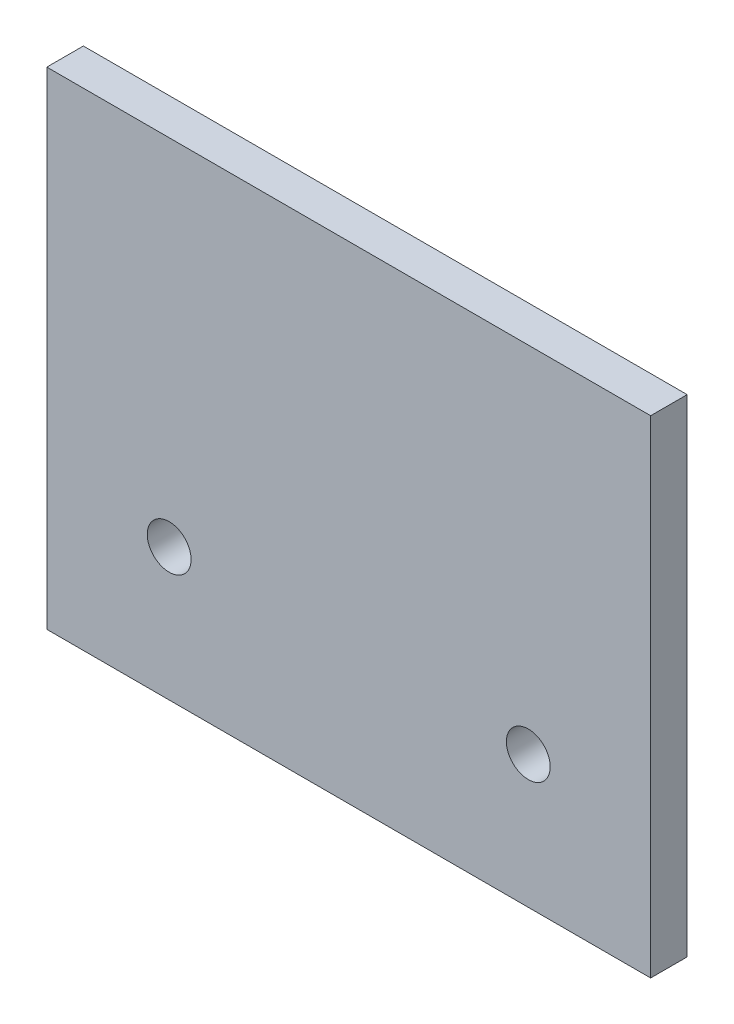
ISO-10303-21;
HEADER;
FILE_DESCRIPTION(('STEP AP214'),'2;1');
FILE_NAME('part.step','',(''),(''),'','','');
FILE_SCHEMA(('AUTOMOTIVE_DESIGN { 1 0 10303 214 1 1 1 1 }'));
ENDSEC;
DATA;
#1=APPLICATION_CONTEXT('core data for automotive mechanical design processes');
#2=APPLICATION_PROTOCOL_DEFINITION('international standard','automotive_design',2000,#1);
#3=PRODUCT_CONTEXT('',#1,'mechanical');
#4=PRODUCT('Part','Part','',(#3));
#5=PRODUCT_RELATED_PRODUCT_CATEGORY('part','',(#4));
#6=PRODUCT_DEFINITION_FORMATION('','',#4);
#7=PRODUCT_DEFINITION_CONTEXT('part definition',#1,'design');
#8=PRODUCT_DEFINITION('design','',#6,#7);
#9=PRODUCT_DEFINITION_SHAPE('','',#8);
#10=(LENGTH_UNIT() NAMED_UNIT(*) SI_UNIT(.MILLI.,.METRE.));
#11=(NAMED_UNIT(*) PLANE_ANGLE_UNIT() SI_UNIT($,.RADIAN.));
#12=(NAMED_UNIT(*) SI_UNIT($,.STERADIAN.) SOLID_ANGLE_UNIT());
#13=UNCERTAINTY_MEASURE_WITH_UNIT(LENGTH_MEASURE(1.E-05),#10,'distance_accuracy_value','');
#14=(GEOMETRIC_REPRESENTATION_CONTEXT(3) GLOBAL_UNCERTAINTY_ASSIGNED_CONTEXT((#13)) GLOBAL_UNIT_ASSIGNED_CONTEXT((#10,
#11,#12)) REPRESENTATION_CONTEXT('',''));
#15=CARTESIAN_POINT('',(0.,0.,0.));
#16=DIRECTION('',(0.,0.,1.));
#17=DIRECTION('',(1.,0.,0.));
#18=AXIS2_PLACEMENT_3D('',#15,#16,#17);
#19=CARTESIAN_POINT('',(0.,0.,3.));
#20=DIRECTION('',(0.,0.,-1.));
#21=DIRECTION('',(-1.,0.,0.));
#22=AXIS2_PLACEMENT_3D('',#19,#20,#21);
#23=PLANE('',#22);
#24=DIRECTION('',(0.,-1.,0.));
#25=VECTOR('',#24,1.);
#26=CARTESIAN_POINT('',(-67.8127878217333,8.21143567112024,3.));
#27=LINE('',#26,#25);
#28=CARTESIAN_POINT('',(-67.8127878217333,48.2114356711202,3.));
#29=VERTEX_POINT('',#28);
#30=CARTESIAN_POINT('',(-67.8127878217333,8.21143567112024,3.));
#31=VERTEX_POINT('',#30);
#32=EDGE_CURVE('E91',#29,#31,#27,.T.);
#33=ORIENTED_EDGE('',*,*,#32,.T.);
#34=DIRECTION('',(1.,0.,0.));
#35=VECTOR('',#34,1.);
#36=CARTESIAN_POINT('',(-67.8127878217333,8.21143567112024,3.));
#37=LINE('',#36,#35);
#38=CARTESIAN_POINT('',(-18.2127878217333,8.21143567112024,3.));
#39=VERTEX_POINT('',#38);
#40=EDGE_CURVE('E86',#31,#39,#37,.T.);
#41=ORIENTED_EDGE('',*,*,#40,.T.);
#42=DIRECTION('',(0.,1.,0.));
#43=VECTOR('',#42,1.);
#44=CARTESIAN_POINT('',(-18.2127878217333,8.21143567112024,3.));
#45=LINE('',#44,#43);
#46=CARTESIAN_POINT('',(-18.2127878217333,48.2114356711202,3.));
#47=VERTEX_POINT('',#46);
#48=EDGE_CURVE('E89',#39,#47,#45,.T.);
#49=ORIENTED_EDGE('',*,*,#48,.T.);
#50=DIRECTION('',(-1.,0.,0.));
#51=VECTOR('',#50,1.);
#52=CARTESIAN_POINT('',(-67.8127878217333,48.2114356711202,3.));
#53=LINE('',#52,#51);
#54=EDGE_CURVE('E56',#47,#29,#53,.T.);
#55=ORIENTED_EDGE('',*,*,#54,.T.);
#56=EDGE_LOOP('',(#33,#41,#49,#55));
#57=FACE_BOUND('',#56,.T.);
#58=CARTESIAN_POINT('',(-28.2627878217329,19.1012624191651,3.));
#59=DIRECTION('',(0.,0.,1.));
#60=DIRECTION('',(1.,0.,0.));
#61=AXIS2_PLACEMENT_3D('',#58,#59,#60);
#62=CIRCLE('',#61,1.79999999999999);
#63=CARTESIAN_POINT('',(-26.4627878217329,19.1012624191651,3.));
#64=VERTEX_POINT('',#63);
#65=EDGE_CURVE('E106',#64,#64,#62,.T.);
#66=ORIENTED_EDGE('',*,*,#65,.F.);
#67=EDGE_LOOP('',(#66));
#68=FACE_BOUND('',#67,.T.);
#69=CARTESIAN_POINT('',(-57.7627878217332,19.1012624191651,3.));
#70=DIRECTION('',(0.,0.,1.));
#71=DIRECTION('',(1.,0.,0.));
#72=AXIS2_PLACEMENT_3D('',#69,#70,#71);
#73=CIRCLE('',#72,1.79999999999999);
#74=CARTESIAN_POINT('',(-55.9627878217332,19.1012624191651,3.));
#75=VERTEX_POINT('',#74);
#76=EDGE_CURVE('E121',#75,#75,#73,.T.);
#77=ORIENTED_EDGE('',*,*,#76,.F.);
#78=EDGE_LOOP('',(#77));
#79=FACE_BOUND('',#78,.T.);
#80=ADVANCED_FACE('F39',(#57,#68,#79),#23,.F.);
#81=CARTESIAN_POINT('',(0.,0.,0.));
#82=DIRECTION('',(0.,0.,-1.));
#83=DIRECTION('',(-1.,0.,0.));
#84=AXIS2_PLACEMENT_3D('',#81,#82,#83);
#85=PLANE('',#84);
#86=CARTESIAN_POINT('',(-28.2627878217329,19.1012624191651,0.));
#87=DIRECTION('',(0.,0.,1.));
#88=DIRECTION('',(1.,0.,0.));
#89=AXIS2_PLACEMENT_3D('',#86,#87,#88);
#90=CIRCLE('',#89,1.79999999999999);
#91=CARTESIAN_POINT('',(-26.4627878217329,19.1012624191651,0.));
#92=VERTEX_POINT('',#91);
#93=EDGE_CURVE('E118',#92,#92,#90,.T.);
#94=ORIENTED_EDGE('',*,*,#93,.T.);
#95=EDGE_LOOP('',(#94));
#96=FACE_BOUND('',#95,.T.);
#97=DIRECTION('',(0.,-1.,0.));
#98=VECTOR('',#97,1.);
#99=CARTESIAN_POINT('',(-67.8127878217333,8.21143567112024,0.));
#100=LINE('',#99,#98);
#101=CARTESIAN_POINT('',(-67.8127878217333,48.2114356711202,0.));
#102=VERTEX_POINT('',#101);
#103=CARTESIAN_POINT('',(-67.8127878217333,8.21143567112024,0.));
#104=VERTEX_POINT('',#103);
#105=EDGE_CURVE('E103',#102,#104,#100,.T.);
#106=ORIENTED_EDGE('',*,*,#105,.F.);
#107=DIRECTION('',(-1.,0.,0.));
#108=VECTOR('',#107,1.);
#109=CARTESIAN_POINT('',(-67.8127878217333,48.2114356711202,0.));
#110=LINE('',#109,#108);
#111=CARTESIAN_POINT('',(-18.2127878217333,48.2114356711202,0.));
#112=VERTEX_POINT('',#111);
#113=EDGE_CURVE('E79',#112,#102,#110,.T.);
#114=ORIENTED_EDGE('',*,*,#113,.F.);
#115=DIRECTION('',(0.,1.,0.));
#116=VECTOR('',#115,1.);
#117=CARTESIAN_POINT('',(-18.2127878217333,8.21143567112024,0.));
#118=LINE('',#117,#116);
#119=CARTESIAN_POINT('',(-18.2127878217333,8.21143567112024,0.));
#120=VERTEX_POINT('',#119);
#121=EDGE_CURVE('E73',#120,#112,#118,.T.);
#122=ORIENTED_EDGE('',*,*,#121,.F.);
#123=DIRECTION('',(1.,0.,0.));
#124=VECTOR('',#123,1.);
#125=CARTESIAN_POINT('',(-67.8127878217333,8.21143567112024,0.));
#126=LINE('',#125,#124);
#127=EDGE_CURVE('E95',#104,#120,#126,.T.);
#128=ORIENTED_EDGE('',*,*,#127,.F.);
#129=EDGE_LOOP('',(#106,#114,#122,#128));
#130=FACE_BOUND('',#129,.T.);
#131=CARTESIAN_POINT('',(-57.7627878217332,19.1012624191651,0.));
#132=DIRECTION('',(0.,0.,1.));
#133=DIRECTION('',(1.,0.,0.));
#134=AXIS2_PLACEMENT_3D('',#131,#132,#133);
#135=CIRCLE('',#134,1.79999999999999);
#136=CARTESIAN_POINT('',(-55.9627878217332,19.1012624191651,0.));
#137=VERTEX_POINT('',#136);
#138=EDGE_CURVE('E124',#137,#137,#135,.T.);
#139=ORIENTED_EDGE('',*,*,#138,.T.);
#140=EDGE_LOOP('',(#139));
#141=FACE_BOUND('',#140,.T.);
#142=ADVANCED_FACE('F114',(#96,#130,#141),#85,.T.);
#143=CARTESIAN_POINT('',(-67.8127878217333,8.21143567112024,3.));
#144=DIRECTION('',(1.,0.,0.));
#145=DIRECTION('',(0.,0.,-1.));
#146=AXIS2_PLACEMENT_3D('',#143,#144,#145);
#147=PLANE('',#146);
#148=ORIENTED_EDGE('',*,*,#105,.T.);
#149=DIRECTION('',(0.,0.,-1.));
#150=VECTOR('',#149,1.);
#151=CARTESIAN_POINT('',(-67.8127878217333,8.21143567112024,3.));
#152=LINE('',#151,#150);
#153=EDGE_CURVE('E11',#31,#104,#152,.T.);
#154=ORIENTED_EDGE('',*,*,#153,.F.);
#155=ORIENTED_EDGE('',*,*,#32,.F.);
#156=DIRECTION('',(0.,0.,-1.));
#157=VECTOR('',#156,1.);
#158=CARTESIAN_POINT('',(-67.8127878217333,48.2114356711202,3.));
#159=LINE('',#158,#157);
#160=EDGE_CURVE('E99',#29,#102,#159,.T.);
#161=ORIENTED_EDGE('',*,*,#160,.T.);
#162=EDGE_LOOP('',(#148,#154,#155,#161));
#163=FACE_BOUND('',#162,.T.);
#164=ADVANCED_FACE('F41',(#163),#147,.F.);
#165=CARTESIAN_POINT('',(-67.8127878217333,8.21143567112024,3.));
#166=DIRECTION('',(0.,1.,0.));
#167=DIRECTION('',(0.,0.,1.));
#168=AXIS2_PLACEMENT_3D('',#165,#166,#167);
#169=PLANE('',#168);
#170=ORIENTED_EDGE('',*,*,#127,.T.);
#171=DIRECTION('',(0.,0.,-1.));
#172=VECTOR('',#171,1.);
#173=CARTESIAN_POINT('',(-18.2127878217333,8.21143567112024,3.));
#174=LINE('',#173,#172);
#175=EDGE_CURVE('E48',#39,#120,#174,.T.);
#176=ORIENTED_EDGE('',*,*,#175,.F.);
#177=ORIENTED_EDGE('',*,*,#40,.F.);
#178=ORIENTED_EDGE('',*,*,#153,.T.);
#179=EDGE_LOOP('',(#170,#176,#177,#178));
#180=FACE_BOUND('',#179,.T.);
#181=ADVANCED_FACE('F94',(#180),#169,.F.);
#182=CARTESIAN_POINT('',(-18.2127878217333,8.21143567112024,3.));
#183=DIRECTION('',(-1.,0.,0.));
#184=DIRECTION('',(0.,0.,1.));
#185=AXIS2_PLACEMENT_3D('',#182,#183,#184);
#186=PLANE('',#185);
#187=ORIENTED_EDGE('',*,*,#121,.T.);
#188=DIRECTION('',(0.,0.,-1.));
#189=VECTOR('',#188,1.);
#190=CARTESIAN_POINT('',(-18.2127878217333,48.2114356711202,3.));
#191=LINE('',#190,#189);
#192=EDGE_CURVE('E96',#47,#112,#191,.T.);
#193=ORIENTED_EDGE('',*,*,#192,.F.);
#194=ORIENTED_EDGE('',*,*,#48,.F.);
#195=ORIENTED_EDGE('',*,*,#175,.T.);
#196=EDGE_LOOP('',(#187,#193,#194,#195));
#197=FACE_BOUND('',#196,.T.);
#198=ADVANCED_FACE('F97',(#197),#186,.F.);
#199=CARTESIAN_POINT('',(-67.8127878217333,48.2114356711202,3.));
#200=DIRECTION('',(0.,-1.,0.));
#201=DIRECTION('',(0.,0.,-1.));
#202=AXIS2_PLACEMENT_3D('',#199,#200,#201);
#203=PLANE('',#202);
#204=ORIENTED_EDGE('',*,*,#113,.T.);
#205=ORIENTED_EDGE('',*,*,#160,.F.);
#206=ORIENTED_EDGE('',*,*,#54,.F.);
#207=ORIENTED_EDGE('',*,*,#192,.T.);
#208=EDGE_LOOP('',(#204,#205,#206,#207));
#209=FACE_BOUND('',#208,.T.);
#210=ADVANCED_FACE('F111',(#209),#203,.F.);
#211=CARTESIAN_POINT('',(-28.2627878217329,19.1012624191651,3.));
#212=DIRECTION('',(0.,0.,-1.));
#213=DIRECTION('',(-1.,0.,0.));
#214=AXIS2_PLACEMENT_3D('',#211,#212,#213);
#215=CYLINDRICAL_SURFACE('',#214,1.79999999999999);
#216=ORIENTED_EDGE('',*,*,#65,.T.);
#217=EDGE_LOOP('',(#216));
#218=FACE_BOUND('',#217,.T.);
#219=ORIENTED_EDGE('',*,*,#93,.F.);
#220=EDGE_LOOP('',(#219));
#221=FACE_BOUND('',#220,.T.);
#222=ADVANCED_FACE('F141',(#218,#221),#215,.F.);
#223=CARTESIAN_POINT('',(-57.7627878217332,19.1012624191651,3.));
#224=DIRECTION('',(0.,0.,-1.));
#225=DIRECTION('',(-1.,0.,0.));
#226=AXIS2_PLACEMENT_3D('',#223,#224,#225);
#227=CYLINDRICAL_SURFACE('',#226,1.79999999999999);
#228=ORIENTED_EDGE('',*,*,#76,.T.);
#229=EDGE_LOOP('',(#228));
#230=FACE_BOUND('',#229,.T.);
#231=ORIENTED_EDGE('',*,*,#138,.F.);
#232=EDGE_LOOP('',(#231));
#233=FACE_BOUND('',#232,.T.);
#234=ADVANCED_FACE('F130',(#230,#233),#227,.F.);
#235=CLOSED_SHELL('',(#80,#142,#164,#181,#198,#210,#222,#234));
#236=MANIFOLD_SOLID_BREP('B2',#235);
#237=ADVANCED_BREP_SHAPE_REPRESENTATION('',(#18,#236),#14);
#238=SHAPE_DEFINITION_REPRESENTATION(#9,#237);
ENDSEC;
END-ISO-10303-21;
